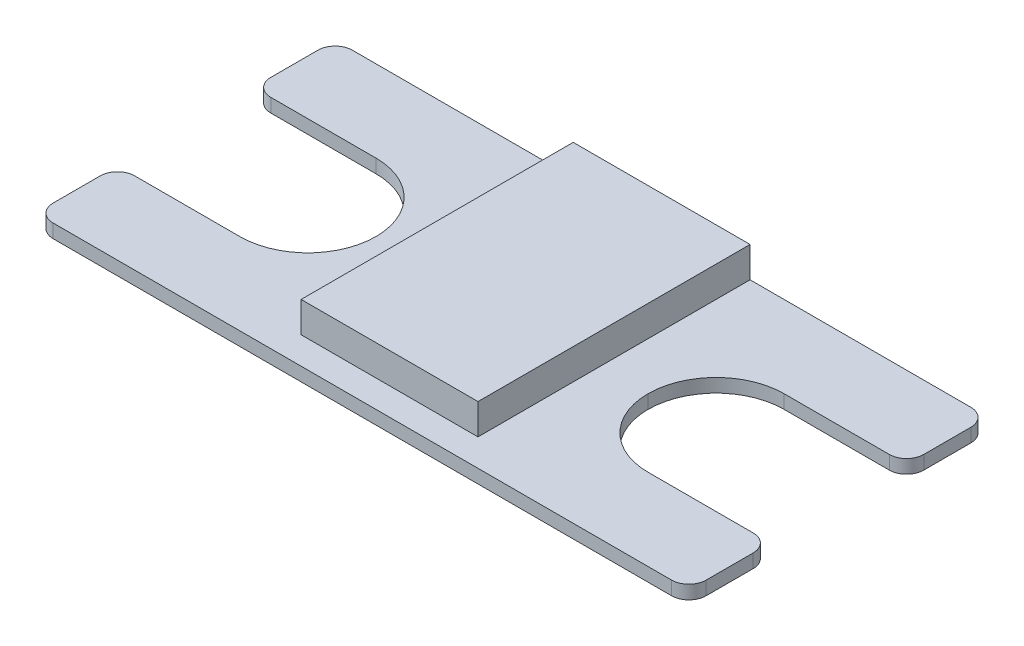
ISO-10303-21;
HEADER;
FILE_DESCRIPTION(('STEP AP214'),'2;1');
FILE_NAME('part.step','',(''),(''),'','','');
FILE_SCHEMA(('AUTOMOTIVE_DESIGN { 1 0 10303 214 1 1 1 1 }'));
ENDSEC;
DATA;
#1=APPLICATION_CONTEXT('core data for automotive mechanical design processes');
#2=APPLICATION_PROTOCOL_DEFINITION('international standard','automotive_design',2000,#1);
#3=PRODUCT_CONTEXT('',#1,'mechanical');
#4=PRODUCT('Part','Part','',(#3));
#5=PRODUCT_RELATED_PRODUCT_CATEGORY('part','',(#4));
#6=PRODUCT_DEFINITION_FORMATION('','',#4);
#7=PRODUCT_DEFINITION_CONTEXT('part definition',#1,'design');
#8=PRODUCT_DEFINITION('design','',#6,#7);
#9=PRODUCT_DEFINITION_SHAPE('','',#8);
#10=(LENGTH_UNIT() NAMED_UNIT(*) SI_UNIT(.MILLI.,.METRE.));
#11=(NAMED_UNIT(*) PLANE_ANGLE_UNIT() SI_UNIT($,.RADIAN.));
#12=(NAMED_UNIT(*) SI_UNIT($,.STERADIAN.) SOLID_ANGLE_UNIT());
#13=UNCERTAINTY_MEASURE_WITH_UNIT(LENGTH_MEASURE(1.E-05),#10,'distance_accuracy_value','');
#14=(GEOMETRIC_REPRESENTATION_CONTEXT(3) GLOBAL_UNCERTAINTY_ASSIGNED_CONTEXT((#13)) GLOBAL_UNIT_ASSIGNED_CONTEXT((#10,
#11,#12)) REPRESENTATION_CONTEXT('',''));
#15=CARTESIAN_POINT('',(0.,0.,0.));
#16=DIRECTION('',(0.,0.,1.));
#17=DIRECTION('',(1.,0.,0.));
#18=AXIS2_PLACEMENT_3D('',#15,#16,#17);
#19=CARTESIAN_POINT('',(0.,1.,0.));
#20=DIRECTION('',(0.,-1.,0.));
#21=DIRECTION('',(0.,0.,-1.));
#22=AXIS2_PLACEMENT_3D('',#19,#20,#21);
#23=PLANE('',#22);
#24=DIRECTION('',(0.,0.,1.));
#25=VECTOR('',#24,1.);
#26=CARTESIAN_POINT('',(17.5,1.,-22.));
#27=LINE('',#26,#25);
#28=CARTESIAN_POINT('',(17.5,1.,-22.));
#29=VERTEX_POINT('',#28);
#30=CARTESIAN_POINT('',(17.5,1.,-2.00000000000001));
#31=VERTEX_POINT('',#30);
#32=EDGE_CURVE('E62',#29,#31,#27,.T.);
#33=ORIENTED_EDGE('',*,*,#32,.F.);
#34=DIRECTION('',(-1.,0.,0.));
#35=VECTOR('',#34,1.);
#36=CARTESIAN_POINT('',(0.,1.,-22.));
#37=LINE('',#36,#35);
#38=CARTESIAN_POINT('',(1.27,1.,-22.));
#39=VERTEX_POINT('',#38);
#40=EDGE_CURVE('E266',#29,#39,#37,.T.);
#41=ORIENTED_EDGE('',*,*,#40,.T.);
#42=CARTESIAN_POINT('',(1.27,1.,-20.73));
#43=DIRECTION('',(0.,-1.,0.));
#44=DIRECTION('',(0.,0.,-1.));
#45=AXIS2_PLACEMENT_3D('',#42,#43,#44);
#46=CIRCLE('',#45,1.27);
#47=CARTESIAN_POINT('',(0.,1.,-20.73));
#48=VERTEX_POINT('',#47);
#49=EDGE_CURVE('E371',#39,#48,#46,.F.);
#50=ORIENTED_EDGE('',*,*,#49,.T.);
#51=DIRECTION('',(0.,0.,1.));
#52=VECTOR('',#51,1.);
#53=CARTESIAN_POINT('',(0.,1.,-16.));
#54=LINE('',#53,#52);
#55=CARTESIAN_POINT('',(0.,1.,-17.27));
#56=VERTEX_POINT('',#55);
#57=EDGE_CURVE('E270',#48,#56,#54,.T.);
#58=ORIENTED_EDGE('',*,*,#57,.T.);
#59=CARTESIAN_POINT('',(1.27,1.,-17.27));
#60=DIRECTION('',(0.,-1.,0.));
#61=DIRECTION('',(0.,0.,-1.));
#62=AXIS2_PLACEMENT_3D('',#59,#60,#61);
#63=CIRCLE('',#62,1.27);
#64=CARTESIAN_POINT('',(1.27,1.,-16.));
#65=VERTEX_POINT('',#64);
#66=EDGE_CURVE('E368',#56,#65,#63,.F.);
#67=ORIENTED_EDGE('',*,*,#66,.T.);
#68=DIRECTION('',(1.,0.,0.));
#69=VECTOR('',#68,1.);
#70=CARTESIAN_POINT('',(14.,1.,-16.));
#71=LINE('',#70,#69);
#72=CARTESIAN_POINT('',(9.,1.,-16.));
#73=VERTEX_POINT('',#72);
#74=EDGE_CURVE('E274',#65,#73,#71,.T.);
#75=ORIENTED_EDGE('',*,*,#74,.T.);
#76=CARTESIAN_POINT('',(9.,1.,-11.));
#77=DIRECTION('',(0.,-1.,0.));
#78=DIRECTION('',(0.,0.,-1.));
#79=AXIS2_PLACEMENT_3D('',#76,#77,#78);
#80=CIRCLE('',#79,5.);
#81=CARTESIAN_POINT('',(14.,1.,-11.));
#82=VERTEX_POINT('',#81);
#83=EDGE_CURVE('E11',#73,#82,#80,.T.);
#84=ORIENTED_EDGE('',*,*,#83,.T.);
#85=CARTESIAN_POINT('',(9.,1.,-11.));
#86=DIRECTION('',(0.,-1.,0.));
#87=DIRECTION('',(0.,0.,-1.));
#88=AXIS2_PLACEMENT_3D('',#85,#86,#87);
#89=CIRCLE('',#88,5.);
#90=CARTESIAN_POINT('',(8.99999999999999,1.,-6.));
#91=VERTEX_POINT('',#90);
#92=EDGE_CURVE('E460',#82,#91,#89,.T.);
#93=ORIENTED_EDGE('',*,*,#92,.T.);
#94=DIRECTION('',(-1.,0.,0.));
#95=VECTOR('',#94,1.);
#96=CARTESIAN_POINT('',(0.,1.,-6.));
#97=LINE('',#96,#95);
#98=CARTESIAN_POINT('',(1.27,1.,-6.));
#99=VERTEX_POINT('',#98);
#100=EDGE_CURVE('E278',#91,#99,#97,.T.);
#101=ORIENTED_EDGE('',*,*,#100,.T.);
#102=CARTESIAN_POINT('',(1.27,1.,-4.73));
#103=DIRECTION('',(0.,-1.,0.));
#104=DIRECTION('',(0.,0.,-1.));
#105=AXIS2_PLACEMENT_3D('',#102,#103,#104);
#106=CIRCLE('',#105,1.27);
#107=CARTESIAN_POINT('',(0.,1.,-4.73));
#108=VERTEX_POINT('',#107);
#109=EDGE_CURVE('E365',#99,#108,#106,.F.);
#110=ORIENTED_EDGE('',*,*,#109,.T.);
#111=DIRECTION('',(0.,0.,1.));
#112=VECTOR('',#111,1.);
#113=CARTESIAN_POINT('',(0.,1.,0.));
#114=LINE('',#113,#112);
#115=CARTESIAN_POINT('',(0.,1.,-1.27));
#116=VERTEX_POINT('',#115);
#117=EDGE_CURVE('E281',#108,#116,#114,.T.);
#118=ORIENTED_EDGE('',*,*,#117,.T.);
#119=CARTESIAN_POINT('',(1.27,1.,-1.27));
#120=DIRECTION('',(0.,-1.,0.));
#121=DIRECTION('',(0.,0.,-1.));
#122=AXIS2_PLACEMENT_3D('',#119,#120,#121);
#123=CIRCLE('',#122,1.27);
#124=CARTESIAN_POINT('',(1.27,1.,0.));
#125=VERTEX_POINT('',#124);
#126=EDGE_CURVE('E362',#116,#125,#123,.F.);
#127=ORIENTED_EDGE('',*,*,#126,.T.);
#128=DIRECTION('',(1.,0.,0.));
#129=VECTOR('',#128,1.);
#130=CARTESIAN_POINT('',(48.,1.,0.));
#131=LINE('',#130,#129);
#132=CARTESIAN_POINT('',(46.73,1.,0.));
#133=VERTEX_POINT('',#132);
#134=EDGE_CURVE('E246',#125,#133,#131,.T.);
#135=ORIENTED_EDGE('',*,*,#134,.T.);
#136=CARTESIAN_POINT('',(46.73,1.,-1.26999999999997));
#137=DIRECTION('',(0.,-1.,0.));
#138=DIRECTION('',(0.,0.,-1.));
#139=AXIS2_PLACEMENT_3D('',#136,#137,#138);
#140=CIRCLE('',#139,1.27);
#141=CARTESIAN_POINT('',(48.,1.,-1.26999999999997));
#142=VERTEX_POINT('',#141);
#143=EDGE_CURVE('E383',#133,#142,#140,.F.);
#144=ORIENTED_EDGE('',*,*,#143,.T.);
#145=DIRECTION('',(0.,0.,-1.));
#146=VECTOR('',#145,1.);
#147=CARTESIAN_POINT('',(48.,1.,-6.));
#148=LINE('',#147,#146);
#149=CARTESIAN_POINT('',(48.,1.,-4.73));
#150=VERTEX_POINT('',#149);
#151=EDGE_CURVE('E250',#142,#150,#148,.T.);
#152=ORIENTED_EDGE('',*,*,#151,.T.);
#153=CARTESIAN_POINT('',(46.73,1.,-4.73));
#154=DIRECTION('',(0.,-1.,0.));
#155=DIRECTION('',(0.,0.,-1.));
#156=AXIS2_PLACEMENT_3D('',#153,#154,#155);
#157=CIRCLE('',#156,1.27);
#158=CARTESIAN_POINT('',(46.73,1.,-6.));
#159=VERTEX_POINT('',#158);
#160=EDGE_CURVE('E380',#150,#159,#157,.F.);
#161=ORIENTED_EDGE('',*,*,#160,.T.);
#162=DIRECTION('',(-1.,0.,0.));
#163=VECTOR('',#162,1.);
#164=CARTESIAN_POINT('',(34.,1.,-6.));
#165=LINE('',#164,#163);
#166=CARTESIAN_POINT('',(39.,1.,-6.));
#167=VERTEX_POINT('',#166);
#168=EDGE_CURVE('E255',#159,#167,#165,.T.);
#169=ORIENTED_EDGE('',*,*,#168,.T.);
#170=CARTESIAN_POINT('',(39.,1.,-11.));
#171=DIRECTION('',(0.,-1.,0.));
#172=DIRECTION('',(0.,0.,-1.));
#173=AXIS2_PLACEMENT_3D('',#170,#171,#172);
#174=CIRCLE('',#173,5.);
#175=CARTESIAN_POINT('',(34.,1.,-11.));
#176=VERTEX_POINT('',#175);
#177=EDGE_CURVE('E448',#167,#176,#174,.T.);
#178=ORIENTED_EDGE('',*,*,#177,.T.);
#179=CARTESIAN_POINT('',(39.,1.,-11.));
#180=DIRECTION('',(0.,-1.,0.));
#181=DIRECTION('',(0.,0.,-1.));
#182=AXIS2_PLACEMENT_3D('',#179,#180,#181);
#183=CIRCLE('',#182,5.);
#184=CARTESIAN_POINT('',(39.,1.,-16.));
#185=VERTEX_POINT('',#184);
#186=EDGE_CURVE('E454',#176,#185,#183,.T.);
#187=ORIENTED_EDGE('',*,*,#186,.T.);
#188=DIRECTION('',(1.,0.,0.));
#189=VECTOR('',#188,1.);
#190=CARTESIAN_POINT('',(48.,1.,-16.));
#191=LINE('',#190,#189);
#192=CARTESIAN_POINT('',(46.73,1.,-16.));
#193=VERTEX_POINT('',#192);
#194=EDGE_CURVE('E259',#185,#193,#191,.T.);
#195=ORIENTED_EDGE('',*,*,#194,.T.);
#196=CARTESIAN_POINT('',(46.73,1.,-17.27));
#197=DIRECTION('',(0.,-1.,0.));
#198=DIRECTION('',(0.,0.,-1.));
#199=AXIS2_PLACEMENT_3D('',#196,#197,#198);
#200=CIRCLE('',#199,1.27);
#201=CARTESIAN_POINT('',(48.,1.,-17.27));
#202=VERTEX_POINT('',#201);
#203=EDGE_CURVE('E377',#193,#202,#200,.F.);
#204=ORIENTED_EDGE('',*,*,#203,.T.);
#205=DIRECTION('',(0.,0.,-1.));
#206=VECTOR('',#205,1.);
#207=CARTESIAN_POINT('',(48.,1.,-22.));
#208=LINE('',#207,#206);
#209=CARTESIAN_POINT('',(48.,1.,-20.73));
#210=VERTEX_POINT('',#209);
#211=EDGE_CURVE('E262',#202,#210,#208,.T.);
#212=ORIENTED_EDGE('',*,*,#211,.T.);
#213=CARTESIAN_POINT('',(46.73,1.,-20.73));
#214=DIRECTION('',(0.,-1.,0.));
#215=DIRECTION('',(0.,0.,-1.));
#216=AXIS2_PLACEMENT_3D('',#213,#214,#215);
#217=CIRCLE('',#216,1.27);
#218=CARTESIAN_POINT('',(46.73,1.,-22.));
#219=VERTEX_POINT('',#218);
#220=EDGE_CURVE('E374',#210,#219,#217,.F.);
#221=ORIENTED_EDGE('',*,*,#220,.T.);
#222=CARTESIAN_POINT('',(30.5,1.,-22.));
#223=VERTEX_POINT('',#222);
#224=EDGE_CURVE('E267',#219,#223,#37,.T.);
#225=ORIENTED_EDGE('',*,*,#224,.T.);
#226=DIRECTION('',(0.,0.,-1.));
#227=VECTOR('',#226,1.);
#228=CARTESIAN_POINT('',(30.5,1.,-22.));
#229=LINE('',#228,#227);
#230=CARTESIAN_POINT('',(30.5,1.,-2.00000000000001));
#231=VERTEX_POINT('',#230);
#232=EDGE_CURVE('E233',#231,#223,#229,.T.);
#233=ORIENTED_EDGE('',*,*,#232,.F.);
#234=DIRECTION('',(1.,0.,0.));
#235=VECTOR('',#234,1.);
#236=CARTESIAN_POINT('',(17.5,1.,-2.00000000000001));
#237=LINE('',#236,#235);
#238=EDGE_CURVE('E57',#31,#231,#237,.T.);
#239=ORIENTED_EDGE('',*,*,#238,.F.);
#240=EDGE_LOOP('',(#33,#41,#50,#58,#67,#75,#84,#93,#101,#110,#118,#127,#135,#144,#152,#161,#169,
#178,#187,#195,#204,#212,#221,#225,#233,#239));
#241=FACE_BOUND('',#240,.T.);
#242=ADVANCED_FACE('F39',(#241),#23,.F.);
#243=CARTESIAN_POINT('',(48.,1.,0.));
#244=DIRECTION('',(0.,0.,-1.));
#245=DIRECTION('',(-1.,0.,0.));
#246=AXIS2_PLACEMENT_3D('',#243,#244,#245);
#247=PLANE('',#246);
#248=DIRECTION('',(1.,0.,0.));
#249=VECTOR('',#248,1.);
#250=CARTESIAN_POINT('',(48.,0.,0.));
#251=LINE('',#250,#249);
#252=CARTESIAN_POINT('',(1.27,0.,0.));
#253=VERTEX_POINT('',#252);
#254=CARTESIAN_POINT('',(46.73,0.,0.));
#255=VERTEX_POINT('',#254);
#256=EDGE_CURVE('E286',#253,#255,#251,.T.);
#257=ORIENTED_EDGE('',*,*,#256,.T.);
#258=DIRECTION('',(0.,-1.,0.));
#259=VECTOR('',#258,1.);
#260=CARTESIAN_POINT('',(46.73,1.,0.));
#261=LINE('',#260,#259);
#262=EDGE_CURVE('E359',#255,#133,#261,.F.);
#263=ORIENTED_EDGE('',*,*,#262,.T.);
#264=ORIENTED_EDGE('',*,*,#134,.F.);
#265=DIRECTION('',(0.,-1.,0.));
#266=VECTOR('',#265,1.);
#267=CARTESIAN_POINT('',(1.27,1.,0.));
#268=LINE('',#267,#266);
#269=EDGE_CURVE('E355',#125,#253,#268,.T.);
#270=ORIENTED_EDGE('',*,*,#269,.T.);
#271=EDGE_LOOP('',(#257,#263,#264,#270));
#272=FACE_BOUND('',#271,.T.);
#273=ADVANCED_FACE('F526',(#272),#247,.F.);
#274=CARTESIAN_POINT('',(48.,1.,-6.));
#275=DIRECTION('',(-1.,0.,0.));
#276=DIRECTION('',(0.,0.,1.));
#277=AXIS2_PLACEMENT_3D('',#274,#275,#276);
#278=PLANE('',#277);
#279=ORIENTED_EDGE('',*,*,#151,.F.);
#280=DIRECTION('',(0.,-1.,0.));
#281=VECTOR('',#280,1.);
#282=CARTESIAN_POINT('',(48.,1.,-1.26999999999997));
#283=LINE('',#282,#281);
#284=CARTESIAN_POINT('',(48.,0.,-1.26999999999997));
#285=VERTEX_POINT('',#284);
#286=EDGE_CURVE('E325',#142,#285,#283,.T.);
#287=ORIENTED_EDGE('',*,*,#286,.T.);
#288=DIRECTION('',(0.,0.,-1.));
#289=VECTOR('',#288,1.);
#290=CARTESIAN_POINT('',(48.,0.,-6.));
#291=LINE('',#290,#289);
#292=CARTESIAN_POINT('',(48.,0.,-4.73));
#293=VERTEX_POINT('',#292);
#294=EDGE_CURVE('E290',#285,#293,#291,.T.);
#295=ORIENTED_EDGE('',*,*,#294,.T.);
#296=DIRECTION('',(0.,-1.,0.));
#297=VECTOR('',#296,1.);
#298=CARTESIAN_POINT('',(48.,1.,-4.73));
#299=LINE('',#298,#297);
#300=EDGE_CURVE('E285',#293,#150,#299,.F.);
#301=ORIENTED_EDGE('',*,*,#300,.T.);
#302=EDGE_LOOP('',(#279,#287,#295,#301));
#303=FACE_BOUND('',#302,.T.);
#304=ADVANCED_FACE('F531',(#303),#278,.F.);
#305=CARTESIAN_POINT('',(34.,1.,-6.));
#306=DIRECTION('',(0.,0.,1.));
#307=DIRECTION('',(1.,0.,0.));
#308=AXIS2_PLACEMENT_3D('',#305,#306,#307);
#309=PLANE('',#308);
#310=DIRECTION('',(-1.,0.,0.));
#311=VECTOR('',#310,1.);
#312=CARTESIAN_POINT('',(34.,0.,-6.));
#313=LINE('',#312,#311);
#314=CARTESIAN_POINT('',(46.73,0.,-6.));
#315=VERTEX_POINT('',#314);
#316=CARTESIAN_POINT('',(39.,0.,-6.));
#317=VERTEX_POINT('',#316);
#318=EDGE_CURVE('E294',#315,#317,#313,.T.);
#319=ORIENTED_EDGE('',*,*,#318,.T.);
#320=DIRECTION('',(0.,-1.,0.));
#321=VECTOR('',#320,1.);
#322=CARTESIAN_POINT('',(39.,1.,-6.));
#323=LINE('',#322,#321);
#324=EDGE_CURVE('E431',#317,#167,#323,.F.);
#325=ORIENTED_EDGE('',*,*,#324,.T.);
#326=ORIENTED_EDGE('',*,*,#168,.F.);
#327=DIRECTION('',(0.,-1.,0.));
#328=VECTOR('',#327,1.);
#329=CARTESIAN_POINT('',(46.73,1.,-6.));
#330=LINE('',#329,#328);
#331=EDGE_CURVE('E386',#159,#315,#330,.T.);
#332=ORIENTED_EDGE('',*,*,#331,.T.);
#333=EDGE_LOOP('',(#319,#325,#326,#332));
#334=FACE_BOUND('',#333,.T.);
#335=ADVANCED_FACE('F563',(#334),#309,.F.);
#336=CARTESIAN_POINT('',(48.,1.,-16.));
#337=DIRECTION('',(0.,0.,-1.));
#338=DIRECTION('',(-1.,0.,0.));
#339=AXIS2_PLACEMENT_3D('',#336,#337,#338);
#340=PLANE('',#339);
#341=ORIENTED_EDGE('',*,*,#194,.F.);
#342=DIRECTION('',(0.,-1.,0.));
#343=VECTOR('',#342,1.);
#344=CARTESIAN_POINT('',(39.,0.,-16.));
#345=LINE('',#344,#343);
#346=CARTESIAN_POINT('',(39.,0.,-16.));
#347=VERTEX_POINT('',#346);
#348=EDGE_CURVE('E435',#185,#347,#345,.T.);
#349=ORIENTED_EDGE('',*,*,#348,.T.);
#350=DIRECTION('',(1.,0.,0.));
#351=VECTOR('',#350,1.);
#352=CARTESIAN_POINT('',(48.,0.,-16.));
#353=LINE('',#352,#351);
#354=CARTESIAN_POINT('',(46.73,0.,-16.));
#355=VERTEX_POINT('',#354);
#356=EDGE_CURVE('E298',#347,#355,#353,.T.);
#357=ORIENTED_EDGE('',*,*,#356,.T.);
#358=DIRECTION('',(0.,-1.,0.));
#359=VECTOR('',#358,1.);
#360=CARTESIAN_POINT('',(46.73,1.,-16.));
#361=LINE('',#360,#359);
#362=EDGE_CURVE('E397',#355,#193,#361,.F.);
#363=ORIENTED_EDGE('',*,*,#362,.T.);
#364=EDGE_LOOP('',(#341,#349,#357,#363));
#365=FACE_BOUND('',#364,.T.);
#366=ADVANCED_FACE('F478',(#365),#340,.F.);
#367=CARTESIAN_POINT('',(48.,1.,-22.));
#368=DIRECTION('',(-1.,0.,0.));
#369=DIRECTION('',(0.,0.,1.));
#370=AXIS2_PLACEMENT_3D('',#367,#368,#369);
#371=PLANE('',#370);
#372=ORIENTED_EDGE('',*,*,#211,.F.);
#373=DIRECTION('',(0.,-1.,0.));
#374=VECTOR('',#373,1.);
#375=CARTESIAN_POINT('',(48.,1.,-17.27));
#376=LINE('',#375,#374);
#377=CARTESIAN_POINT('',(48.,0.,-17.27));
#378=VERTEX_POINT('',#377);
#379=EDGE_CURVE('E393',#202,#378,#376,.T.);
#380=ORIENTED_EDGE('',*,*,#379,.T.);
#381=DIRECTION('',(0.,0.,-1.));
#382=VECTOR('',#381,1.);
#383=CARTESIAN_POINT('',(48.,0.,-22.));
#384=LINE('',#383,#382);
#385=CARTESIAN_POINT('',(48.,0.,-20.73));
#386=VERTEX_POINT('',#385);
#387=EDGE_CURVE('E301',#378,#386,#384,.T.);
#388=ORIENTED_EDGE('',*,*,#387,.T.);
#389=DIRECTION('',(0.,-1.,0.));
#390=VECTOR('',#389,1.);
#391=CARTESIAN_POINT('',(48.,1.,-20.73));
#392=LINE('',#391,#390);
#393=EDGE_CURVE('E390',#386,#210,#392,.F.);
#394=ORIENTED_EDGE('',*,*,#393,.T.);
#395=EDGE_LOOP('',(#372,#380,#388,#394));
#396=FACE_BOUND('',#395,.T.);
#397=ADVANCED_FACE('F488',(#396),#371,.F.);
#398=CARTESIAN_POINT('',(0.,1.,-22.));
#399=DIRECTION('',(0.,0.,1.));
#400=DIRECTION('',(1.,0.,0.));
#401=AXIS2_PLACEMENT_3D('',#398,#399,#400);
#402=PLANE('',#401);
#403=ORIENTED_EDGE('',*,*,#224,.F.);
#404=DIRECTION('',(0.,-1.,0.));
#405=VECTOR('',#404,1.);
#406=CARTESIAN_POINT('',(46.73,1.,-22.));
#407=LINE('',#406,#405);
#408=CARTESIAN_POINT('',(46.73,0.,-22.));
#409=VERTEX_POINT('',#408);
#410=EDGE_CURVE('E405',#219,#409,#407,.T.);
#411=ORIENTED_EDGE('',*,*,#410,.T.);
#412=DIRECTION('',(-1.,0.,0.));
#413=VECTOR('',#412,1.);
#414=CARTESIAN_POINT('',(0.,0.,-22.));
#415=LINE('',#414,#413);
#416=CARTESIAN_POINT('',(1.27,0.,-22.));
#417=VERTEX_POINT('',#416);
#418=EDGE_CURVE('E305',#409,#417,#415,.T.);
#419=ORIENTED_EDGE('',*,*,#418,.T.);
#420=DIRECTION('',(0.,-1.,0.));
#421=VECTOR('',#420,1.);
#422=CARTESIAN_POINT('',(1.27,1.,-22.));
#423=LINE('',#422,#421);
#424=EDGE_CURVE('E401',#417,#39,#423,.F.);
#425=ORIENTED_EDGE('',*,*,#424,.T.);
#426=ORIENTED_EDGE('',*,*,#40,.F.);
#427=DIRECTION('',(0.,-1.,0.));
#428=VECTOR('',#427,1.);
#429=CARTESIAN_POINT('',(17.5,3.25,-22.));
#430=LINE('',#429,#428);
#431=CARTESIAN_POINT('',(17.5,3.25,-22.));
#432=VERTEX_POINT('',#431);
#433=EDGE_CURVE('E503',#432,#29,#430,.T.);
#434=ORIENTED_EDGE('',*,*,#433,.F.);
#435=DIRECTION('',(-1.,0.,0.));
#436=VECTOR('',#435,1.);
#437=CARTESIAN_POINT('',(17.5,3.25,-22.));
#438=LINE('',#437,#436);
#439=CARTESIAN_POINT('',(30.5,3.25,-22.));
#440=VERTEX_POINT('',#439);
#441=EDGE_CURVE('E228',#440,#432,#438,.T.);
#442=ORIENTED_EDGE('',*,*,#441,.F.);
#443=DIRECTION('',(0.,-1.,0.));
#444=VECTOR('',#443,1.);
#445=CARTESIAN_POINT('',(30.5,3.25,-22.));
#446=LINE('',#445,#444);
#447=EDGE_CURVE('E242',#440,#223,#446,.T.);
#448=ORIENTED_EDGE('',*,*,#447,.T.);
#449=EDGE_LOOP('',(#403,#411,#419,#425,#426,#434,#442,#448));
#450=FACE_BOUND('',#449,.T.);
#451=ADVANCED_FACE('F498',(#450),#402,.F.);
#452=CARTESIAN_POINT('',(0.,1.,-16.));
#453=DIRECTION('',(1.,0.,0.));
#454=DIRECTION('',(0.,0.,-1.));
#455=AXIS2_PLACEMENT_3D('',#452,#453,#454);
#456=PLANE('',#455);
#457=ORIENTED_EDGE('',*,*,#57,.F.);
#458=DIRECTION('',(0.,-1.,0.));
#459=VECTOR('',#458,1.);
#460=CARTESIAN_POINT('',(0.,1.,-20.73));
#461=LINE('',#460,#459);
#462=CARTESIAN_POINT('',(0.,0.,-20.73));
#463=VERTEX_POINT('',#462);
#464=EDGE_CURVE('E412',#48,#463,#461,.T.);
#465=ORIENTED_EDGE('',*,*,#464,.T.);
#466=DIRECTION('',(0.,0.,1.));
#467=VECTOR('',#466,1.);
#468=CARTESIAN_POINT('',(0.,0.,-16.));
#469=LINE('',#468,#467);
#470=CARTESIAN_POINT('',(0.,0.,-17.27));
#471=VERTEX_POINT('',#470);
#472=EDGE_CURVE('E309',#463,#471,#469,.T.);
#473=ORIENTED_EDGE('',*,*,#472,.T.);
#474=DIRECTION('',(0.,-1.,0.));
#475=VECTOR('',#474,1.);
#476=CARTESIAN_POINT('',(0.,1.,-17.27));
#477=LINE('',#476,#475);
#478=EDGE_CURVE('E409',#471,#56,#477,.F.);
#479=ORIENTED_EDGE('',*,*,#478,.T.);
#480=EDGE_LOOP('',(#457,#465,#473,#479));
#481=FACE_BOUND('',#480,.T.);
#482=ADVANCED_FACE('F552',(#481),#456,.F.);
#483=CARTESIAN_POINT('',(14.,1.,-16.));
#484=DIRECTION('',(0.,0.,-1.));
#485=DIRECTION('',(-1.,0.,0.));
#486=AXIS2_PLACEMENT_3D('',#483,#484,#485);
#487=PLANE('',#486);
#488=DIRECTION('',(1.,0.,0.));
#489=VECTOR('',#488,1.);
#490=CARTESIAN_POINT('',(14.,0.,-16.));
#491=LINE('',#490,#489);
#492=CARTESIAN_POINT('',(1.27,0.,-16.));
#493=VERTEX_POINT('',#492);
#494=CARTESIAN_POINT('',(9.,0.,-16.));
#495=VERTEX_POINT('',#494);
#496=EDGE_CURVE('E313',#493,#495,#491,.T.);
#497=ORIENTED_EDGE('',*,*,#496,.T.);
#498=DIRECTION('',(0.,-1.,0.));
#499=VECTOR('',#498,1.);
#500=CARTESIAN_POINT('',(9.,1.,-16.));
#501=LINE('',#500,#499);
#502=EDGE_CURVE('E442',#495,#73,#501,.F.);
#503=ORIENTED_EDGE('',*,*,#502,.T.);
#504=ORIENTED_EDGE('',*,*,#74,.F.);
#505=DIRECTION('',(0.,-1.,0.));
#506=VECTOR('',#505,1.);
#507=CARTESIAN_POINT('',(1.27,1.,-16.));
#508=LINE('',#507,#506);
#509=EDGE_CURVE('E416',#65,#493,#508,.T.);
#510=ORIENTED_EDGE('',*,*,#509,.T.);
#511=EDGE_LOOP('',(#497,#503,#504,#510));
#512=FACE_BOUND('',#511,.T.);
#513=ADVANCED_FACE('F548',(#512),#487,.F.);
#514=CARTESIAN_POINT('',(0.,1.,-6.));
#515=DIRECTION('',(0.,0.,1.));
#516=DIRECTION('',(1.,0.,0.));
#517=AXIS2_PLACEMENT_3D('',#514,#515,#516);
#518=PLANE('',#517);
#519=ORIENTED_EDGE('',*,*,#100,.F.);
#520=DIRECTION('',(0.,-1.,0.));
#521=VECTOR('',#520,1.);
#522=CARTESIAN_POINT('',(9.,0.,-6.));
#523=LINE('',#522,#521);
#524=CARTESIAN_POINT('',(8.99999999999999,0.,-6.));
#525=VERTEX_POINT('',#524);
#526=EDGE_CURVE('E438',#91,#525,#523,.T.);
#527=ORIENTED_EDGE('',*,*,#526,.T.);
#528=DIRECTION('',(-1.,0.,0.));
#529=VECTOR('',#528,1.);
#530=CARTESIAN_POINT('',(0.,0.,-6.));
#531=LINE('',#530,#529);
#532=CARTESIAN_POINT('',(1.27,0.,-6.));
#533=VERTEX_POINT('',#532);
#534=EDGE_CURVE('E317',#525,#533,#531,.T.);
#535=ORIENTED_EDGE('',*,*,#534,.T.);
#536=DIRECTION('',(0.,-1.,0.));
#537=VECTOR('',#536,1.);
#538=CARTESIAN_POINT('',(1.27,1.,-6.));
#539=LINE('',#538,#537);
#540=EDGE_CURVE('E427',#533,#99,#539,.F.);
#541=ORIENTED_EDGE('',*,*,#540,.T.);
#542=EDGE_LOOP('',(#519,#527,#535,#541));
#543=FACE_BOUND('',#542,.T.);
#544=ADVANCED_FACE('F544',(#543),#518,.F.);
#545=CARTESIAN_POINT('',(0.,1.,0.));
#546=DIRECTION('',(1.,0.,0.));
#547=DIRECTION('',(0.,0.,-1.));
#548=AXIS2_PLACEMENT_3D('',#545,#546,#547);
#549=PLANE('',#548);
#550=ORIENTED_EDGE('',*,*,#117,.F.);
#551=DIRECTION('',(0.,-1.,0.));
#552=VECTOR('',#551,1.);
#553=CARTESIAN_POINT('',(0.,1.,-4.73));
#554=LINE('',#553,#552);
#555=CARTESIAN_POINT('',(0.,0.,-4.73));
#556=VERTEX_POINT('',#555);
#557=EDGE_CURVE('E423',#108,#556,#554,.T.);
#558=ORIENTED_EDGE('',*,*,#557,.T.);
#559=DIRECTION('',(0.,0.,1.));
#560=VECTOR('',#559,1.);
#561=CARTESIAN_POINT('',(0.,0.,0.));
#562=LINE('',#561,#560);
#563=CARTESIAN_POINT('',(0.,0.,-1.27));
#564=VERTEX_POINT('',#563);
#565=EDGE_CURVE('E251',#556,#564,#562,.T.);
#566=ORIENTED_EDGE('',*,*,#565,.T.);
#567=DIRECTION('',(0.,-1.,0.));
#568=VECTOR('',#567,1.);
#569=CARTESIAN_POINT('',(0.,1.,-1.27));
#570=LINE('',#569,#568);
#571=EDGE_CURVE('E420',#564,#116,#570,.F.);
#572=ORIENTED_EDGE('',*,*,#571,.T.);
#573=EDGE_LOOP('',(#550,#558,#566,#572));
#574=FACE_BOUND('',#573,.T.);
#575=ADVANCED_FACE('F540',(#574),#549,.F.);
#576=CARTESIAN_POINT('',(0.,0.,0.));
#577=DIRECTION('',(0.,-1.,0.));
#578=DIRECTION('',(0.,0.,-1.));
#579=AXIS2_PLACEMENT_3D('',#576,#577,#578);
#580=PLANE('',#579);
#581=ORIENTED_EDGE('',*,*,#294,.F.);
#582=CARTESIAN_POINT('',(46.73,0.,-1.26999999999997));
#583=DIRECTION('',(0.,-1.,0.));
#584=DIRECTION('',(0.,0.,-1.));
#585=AXIS2_PLACEMENT_3D('',#582,#583,#584);
#586=CIRCLE('',#585,1.27);
#587=EDGE_CURVE('E352',#285,#255,#586,.T.);
#588=ORIENTED_EDGE('',*,*,#587,.T.);
#589=ORIENTED_EDGE('',*,*,#256,.F.);
#590=CARTESIAN_POINT('',(1.27,0.,-1.27));
#591=DIRECTION('',(0.,-1.,0.));
#592=DIRECTION('',(0.,0.,-1.));
#593=AXIS2_PLACEMENT_3D('',#590,#591,#592);
#594=CIRCLE('',#593,1.27);
#595=EDGE_CURVE('E329',#253,#564,#594,.T.);
#596=ORIENTED_EDGE('',*,*,#595,.T.);
#597=ORIENTED_EDGE('',*,*,#565,.F.);
#598=CARTESIAN_POINT('',(1.27,0.,-4.73));
#599=DIRECTION('',(0.,-1.,0.));
#600=DIRECTION('',(0.,0.,-1.));
#601=AXIS2_PLACEMENT_3D('',#598,#599,#600);
#602=CIRCLE('',#601,1.27);
#603=EDGE_CURVE('E332',#556,#533,#602,.T.);
#604=ORIENTED_EDGE('',*,*,#603,.T.);
#605=ORIENTED_EDGE('',*,*,#534,.F.);
#606=CARTESIAN_POINT('',(9.,0.,-11.));
#607=DIRECTION('',(0.,-1.,0.));
#608=DIRECTION('',(0.,0.,-1.));
#609=AXIS2_PLACEMENT_3D('',#606,#607,#608);
#610=CIRCLE('',#609,5.);
#611=CARTESIAN_POINT('',(14.,0.,-11.));
#612=VERTEX_POINT('',#611);
#613=EDGE_CURVE('E457',#525,#612,#610,.F.);
#614=ORIENTED_EDGE('',*,*,#613,.T.);
#615=CARTESIAN_POINT('',(9.,0.,-11.));
#616=DIRECTION('',(0.,-1.,0.));
#617=DIRECTION('',(0.,0.,-1.));
#618=AXIS2_PLACEMENT_3D('',#615,#616,#617);
#619=CIRCLE('',#618,5.);
#620=EDGE_CURVE('E49',#612,#495,#619,.F.);
#621=ORIENTED_EDGE('',*,*,#620,.T.);
#622=ORIENTED_EDGE('',*,*,#496,.F.);
#623=CARTESIAN_POINT('',(1.27,0.,-17.27));
#624=DIRECTION('',(0.,-1.,0.));
#625=DIRECTION('',(0.,0.,-1.));
#626=AXIS2_PLACEMENT_3D('',#623,#624,#625);
#627=CIRCLE('',#626,1.27);
#628=EDGE_CURVE('E336',#493,#471,#627,.T.);
#629=ORIENTED_EDGE('',*,*,#628,.T.);
#630=ORIENTED_EDGE('',*,*,#472,.F.);
#631=CARTESIAN_POINT('',(1.27,0.,-20.73));
#632=DIRECTION('',(0.,-1.,0.));
#633=DIRECTION('',(0.,0.,-1.));
#634=AXIS2_PLACEMENT_3D('',#631,#632,#633);
#635=CIRCLE('',#634,1.27);
#636=EDGE_CURVE('E339',#463,#417,#635,.T.);
#637=ORIENTED_EDGE('',*,*,#636,.T.);
#638=ORIENTED_EDGE('',*,*,#418,.F.);
#639=CARTESIAN_POINT('',(46.73,0.,-20.73));
#640=DIRECTION('',(0.,-1.,0.));
#641=DIRECTION('',(0.,0.,-1.));
#642=AXIS2_PLACEMENT_3D('',#639,#640,#641);
#643=CIRCLE('',#642,1.27);
#644=EDGE_CURVE('E342',#409,#386,#643,.T.);
#645=ORIENTED_EDGE('',*,*,#644,.T.);
#646=ORIENTED_EDGE('',*,*,#387,.F.);
#647=CARTESIAN_POINT('',(46.73,0.,-17.27));
#648=DIRECTION('',(0.,-1.,0.));
#649=DIRECTION('',(0.,0.,-1.));
#650=AXIS2_PLACEMENT_3D('',#647,#648,#649);
#651=CIRCLE('',#650,1.27);
#652=EDGE_CURVE('E345',#378,#355,#651,.T.);
#653=ORIENTED_EDGE('',*,*,#652,.T.);
#654=ORIENTED_EDGE('',*,*,#356,.F.);
#655=CARTESIAN_POINT('',(39.,0.,-11.));
#656=DIRECTION('',(0.,-1.,0.));
#657=DIRECTION('',(0.,0.,-1.));
#658=AXIS2_PLACEMENT_3D('',#655,#656,#657);
#659=CIRCLE('',#658,5.);
#660=CARTESIAN_POINT('',(34.,0.,-11.));
#661=VERTEX_POINT('',#660);
#662=EDGE_CURVE('E451',#347,#661,#659,.F.);
#663=ORIENTED_EDGE('',*,*,#662,.T.);
#664=CARTESIAN_POINT('',(39.,0.,-11.));
#665=DIRECTION('',(0.,-1.,0.));
#666=DIRECTION('',(0.,0.,-1.));
#667=AXIS2_PLACEMENT_3D('',#664,#665,#666);
#668=CIRCLE('',#667,5.);
#669=EDGE_CURVE('E445',#661,#317,#668,.F.);
#670=ORIENTED_EDGE('',*,*,#669,.T.);
#671=ORIENTED_EDGE('',*,*,#318,.F.);
#672=CARTESIAN_POINT('',(46.73,0.,-4.73));
#673=DIRECTION('',(0.,-1.,0.));
#674=DIRECTION('',(0.,0.,-1.));
#675=AXIS2_PLACEMENT_3D('',#672,#673,#674);
#676=CIRCLE('',#675,1.27);
#677=EDGE_CURVE('E349',#315,#293,#676,.T.);
#678=ORIENTED_EDGE('',*,*,#677,.T.);
#679=EDGE_LOOP('',(#581,#588,#589,#596,#597,#604,#605,#614,#621,#622,#629,#630,#637,#638,#645,
#646,#653,#654,#663,#670,#671,#678));
#680=FACE_BOUND('',#679,.T.);
#681=ADVANCED_FACE('F536',(#680),#580,.T.);
#682=CARTESIAN_POINT('',(46.73,1.,-1.26999999999997));
#683=DIRECTION('',(0.,-1.,0.));
#684=DIRECTION('',(0.,0.,-1.));
#685=AXIS2_PLACEMENT_3D('',#682,#683,#684);
#686=CYLINDRICAL_SURFACE('',#685,1.27);
#687=ORIENTED_EDGE('',*,*,#143,.F.);
#688=ORIENTED_EDGE('',*,*,#262,.F.);
#689=ORIENTED_EDGE('',*,*,#587,.F.);
#690=ORIENTED_EDGE('',*,*,#286,.F.);
#691=EDGE_LOOP('',(#687,#688,#689,#690));
#692=FACE_BOUND('',#691,.T.);
#693=ADVANCED_FACE('F539',(#692),#686,.T.);
#694=CARTESIAN_POINT('',(46.73,1.,-4.73));
#695=DIRECTION('',(0.,-1.,0.));
#696=DIRECTION('',(0.,0.,-1.));
#697=AXIS2_PLACEMENT_3D('',#694,#695,#696);
#698=CYLINDRICAL_SURFACE('',#697,1.27);
#699=ORIENTED_EDGE('',*,*,#160,.F.);
#700=ORIENTED_EDGE('',*,*,#300,.F.);
#701=ORIENTED_EDGE('',*,*,#677,.F.);
#702=ORIENTED_EDGE('',*,*,#331,.F.);
#703=EDGE_LOOP('',(#699,#700,#701,#702));
#704=FACE_BOUND('',#703,.T.);
#705=ADVANCED_FACE('F572',(#704),#698,.T.);
#706=CARTESIAN_POINT('',(46.73,1.,-17.27));
#707=DIRECTION('',(0.,-1.,0.));
#708=DIRECTION('',(0.,0.,-1.));
#709=AXIS2_PLACEMENT_3D('',#706,#707,#708);
#710=CYLINDRICAL_SURFACE('',#709,1.27);
#711=ORIENTED_EDGE('',*,*,#203,.F.);
#712=ORIENTED_EDGE('',*,*,#362,.F.);
#713=ORIENTED_EDGE('',*,*,#652,.F.);
#714=ORIENTED_EDGE('',*,*,#379,.F.);
#715=EDGE_LOOP('',(#711,#712,#713,#714));
#716=FACE_BOUND('',#715,.T.);
#717=ADVANCED_FACE('F484',(#716),#710,.T.);
#718=CARTESIAN_POINT('',(46.73,1.,-20.73));
#719=DIRECTION('',(0.,-1.,0.));
#720=DIRECTION('',(0.,0.,-1.));
#721=AXIS2_PLACEMENT_3D('',#718,#719,#720);
#722=CYLINDRICAL_SURFACE('',#721,1.27);
#723=ORIENTED_EDGE('',*,*,#220,.F.);
#724=ORIENTED_EDGE('',*,*,#393,.F.);
#725=ORIENTED_EDGE('',*,*,#644,.F.);
#726=ORIENTED_EDGE('',*,*,#410,.F.);
#727=EDGE_LOOP('',(#723,#724,#725,#726));
#728=FACE_BOUND('',#727,.T.);
#729=ADVANCED_FACE('F492',(#728),#722,.T.);
#730=CARTESIAN_POINT('',(1.27,1.,-20.73));
#731=DIRECTION('',(0.,-1.,0.));
#732=DIRECTION('',(0.,0.,-1.));
#733=AXIS2_PLACEMENT_3D('',#730,#731,#732);
#734=CYLINDRICAL_SURFACE('',#733,1.27);
#735=ORIENTED_EDGE('',*,*,#49,.F.);
#736=ORIENTED_EDGE('',*,*,#424,.F.);
#737=ORIENTED_EDGE('',*,*,#636,.F.);
#738=ORIENTED_EDGE('',*,*,#464,.F.);
#739=EDGE_LOOP('',(#735,#736,#737,#738));
#740=FACE_BOUND('',#739,.T.);
#741=ADVANCED_FACE('F581',(#740),#734,.T.);
#742=CARTESIAN_POINT('',(1.27,1.,-17.27));
#743=DIRECTION('',(0.,-1.,0.));
#744=DIRECTION('',(0.,0.,-1.));
#745=AXIS2_PLACEMENT_3D('',#742,#743,#744);
#746=CYLINDRICAL_SURFACE('',#745,1.27);
#747=ORIENTED_EDGE('',*,*,#66,.F.);
#748=ORIENTED_EDGE('',*,*,#478,.F.);
#749=ORIENTED_EDGE('',*,*,#628,.F.);
#750=ORIENTED_EDGE('',*,*,#509,.F.);
#751=EDGE_LOOP('',(#747,#748,#749,#750));
#752=FACE_BOUND('',#751,.T.);
#753=ADVANCED_FACE('F584',(#752),#746,.T.);
#754=CARTESIAN_POINT('',(1.27,1.,-4.73));
#755=DIRECTION('',(0.,-1.,0.));
#756=DIRECTION('',(0.,0.,-1.));
#757=AXIS2_PLACEMENT_3D('',#754,#755,#756);
#758=CYLINDRICAL_SURFACE('',#757,1.27);
#759=ORIENTED_EDGE('',*,*,#109,.F.);
#760=ORIENTED_EDGE('',*,*,#540,.F.);
#761=ORIENTED_EDGE('',*,*,#603,.F.);
#762=ORIENTED_EDGE('',*,*,#557,.F.);
#763=EDGE_LOOP('',(#759,#760,#761,#762));
#764=FACE_BOUND('',#763,.T.);
#765=ADVANCED_FACE('F588',(#764),#758,.T.);
#766=CARTESIAN_POINT('',(1.27,1.,-1.27));
#767=DIRECTION('',(0.,-1.,0.));
#768=DIRECTION('',(0.,0.,-1.));
#769=AXIS2_PLACEMENT_3D('',#766,#767,#768);
#770=CYLINDRICAL_SURFACE('',#769,1.27);
#771=ORIENTED_EDGE('',*,*,#126,.F.);
#772=ORIENTED_EDGE('',*,*,#571,.F.);
#773=ORIENTED_EDGE('',*,*,#595,.F.);
#774=ORIENTED_EDGE('',*,*,#269,.F.);
#775=EDGE_LOOP('',(#771,#772,#773,#774));
#776=FACE_BOUND('',#775,.T.);
#777=ADVANCED_FACE('F592',(#776),#770,.T.);
#778=CARTESIAN_POINT('',(39.,1.,-11.));
#779=DIRECTION('',(0.,1.,0.));
#780=DIRECTION('',(0.,0.,1.));
#781=AXIS2_PLACEMENT_3D('',#778,#779,#780);
#782=CYLINDRICAL_SURFACE('',#781,5.);
#783=ORIENTED_EDGE('',*,*,#348,.F.);
#784=ORIENTED_EDGE('',*,*,#186,.F.);
#785=DIRECTION('',(0.,-1.,0.));
#786=VECTOR('',#785,1.);
#787=CARTESIAN_POINT('',(34.,1.,-11.));
#788=LINE('',#787,#786);
#789=EDGE_CURVE('E241',#661,#176,#788,.F.);
#790=ORIENTED_EDGE('',*,*,#789,.F.);
#791=ORIENTED_EDGE('',*,*,#662,.F.);
#792=EDGE_LOOP('',(#783,#784,#790,#791));
#793=FACE_BOUND('',#792,.T.);
#794=ADVANCED_FACE('F475',(#793),#782,.F.);
#795=CARTESIAN_POINT('',(39.,1.,-11.));
#796=DIRECTION('',(0.,1.,0.));
#797=DIRECTION('',(0.,0.,1.));
#798=AXIS2_PLACEMENT_3D('',#795,#796,#797);
#799=CYLINDRICAL_SURFACE('',#798,5.);
#800=ORIENTED_EDGE('',*,*,#177,.F.);
#801=ORIENTED_EDGE('',*,*,#324,.F.);
#802=ORIENTED_EDGE('',*,*,#669,.F.);
#803=ORIENTED_EDGE('',*,*,#789,.T.);
#804=EDGE_LOOP('',(#800,#801,#802,#803));
#805=FACE_BOUND('',#804,.T.);
#806=ADVANCED_FACE('F469',(#805),#799,.F.);
#807=CARTESIAN_POINT('',(9.,1.,-11.));
#808=DIRECTION('',(0.,1.,0.));
#809=DIRECTION('',(0.,0.,1.));
#810=AXIS2_PLACEMENT_3D('',#807,#808,#809);
#811=CYLINDRICAL_SURFACE('',#810,5.);
#812=DIRECTION('',(0.,-1.,0.));
#813=VECTOR('',#812,1.);
#814=CARTESIAN_POINT('',(14.,0.,-11.));
#815=LINE('',#814,#813);
#816=EDGE_CURVE('E43',#82,#612,#815,.T.);
#817=ORIENTED_EDGE('',*,*,#816,.F.);
#818=ORIENTED_EDGE('',*,*,#83,.F.);
#819=ORIENTED_EDGE('',*,*,#502,.F.);
#820=ORIENTED_EDGE('',*,*,#620,.F.);
#821=EDGE_LOOP('',(#817,#818,#819,#820));
#822=FACE_BOUND('',#821,.T.);
#823=ADVANCED_FACE('F41',(#822),#811,.F.);
#824=CARTESIAN_POINT('',(9.,1.,-11.));
#825=DIRECTION('',(0.,1.,0.));
#826=DIRECTION('',(0.,0.,1.));
#827=AXIS2_PLACEMENT_3D('',#824,#825,#826);
#828=CYLINDRICAL_SURFACE('',#827,5.);
#829=ORIENTED_EDGE('',*,*,#92,.F.);
#830=ORIENTED_EDGE('',*,*,#816,.T.);
#831=ORIENTED_EDGE('',*,*,#613,.F.);
#832=ORIENTED_EDGE('',*,*,#526,.F.);
#833=EDGE_LOOP('',(#829,#830,#831,#832));
#834=FACE_BOUND('',#833,.T.);
#835=ADVANCED_FACE('F600',(#834),#828,.F.);
#836=CARTESIAN_POINT('',(17.5,3.25,-22.));
#837=DIRECTION('',(1.,0.,0.));
#838=DIRECTION('',(0.,0.,-1.));
#839=AXIS2_PLACEMENT_3D('',#836,#837,#838);
#840=PLANE('',#839);
#841=ORIENTED_EDGE('',*,*,#32,.T.);
#842=DIRECTION('',(0.,-1.,0.));
#843=VECTOR('',#842,1.);
#844=CARTESIAN_POINT('',(17.5,3.25,-2.00000000000001));
#845=LINE('',#844,#843);
#846=CARTESIAN_POINT('',(17.5,3.25,-2.00000000000001));
#847=VERTEX_POINT('',#846);
#848=EDGE_CURVE('E216',#847,#31,#845,.T.);
#849=ORIENTED_EDGE('',*,*,#848,.F.);
#850=DIRECTION('',(0.,0.,1.));
#851=VECTOR('',#850,1.);
#852=CARTESIAN_POINT('',(17.5,3.25,-22.));
#853=LINE('',#852,#851);
#854=EDGE_CURVE('E223',#432,#847,#853,.T.);
#855=ORIENTED_EDGE('',*,*,#854,.F.);
#856=ORIENTED_EDGE('',*,*,#433,.T.);
#857=EDGE_LOOP('',(#841,#849,#855,#856));
#858=FACE_BOUND('',#857,.T.);
#859=ADVANCED_FACE('F235',(#858),#840,.F.);
#860=CARTESIAN_POINT('',(17.5,3.25,-2.00000000000001));
#861=DIRECTION('',(0.,0.,-1.));
#862=DIRECTION('',(-1.,0.,0.));
#863=AXIS2_PLACEMENT_3D('',#860,#861,#862);
#864=PLANE('',#863);
#865=ORIENTED_EDGE('',*,*,#238,.T.);
#866=DIRECTION('',(0.,-1.,0.));
#867=VECTOR('',#866,1.);
#868=CARTESIAN_POINT('',(30.5,3.25,-2.00000000000001));
#869=LINE('',#868,#867);
#870=CARTESIAN_POINT('',(30.5,3.25,-2.00000000000001));
#871=VERTEX_POINT('',#870);
#872=EDGE_CURVE('E218',#871,#231,#869,.T.);
#873=ORIENTED_EDGE('',*,*,#872,.F.);
#874=DIRECTION('',(1.,0.,0.));
#875=VECTOR('',#874,1.);
#876=CARTESIAN_POINT('',(17.5,3.25,-2.00000000000001));
#877=LINE('',#876,#875);
#878=EDGE_CURVE('E212',#847,#871,#877,.T.);
#879=ORIENTED_EDGE('',*,*,#878,.F.);
#880=ORIENTED_EDGE('',*,*,#848,.T.);
#881=EDGE_LOOP('',(#865,#873,#879,#880));
#882=FACE_BOUND('',#881,.T.);
#883=ADVANCED_FACE('F214',(#882),#864,.F.);
#884=CARTESIAN_POINT('',(30.5,3.25,-22.));
#885=DIRECTION('',(-1.,0.,0.));
#886=DIRECTION('',(0.,0.,1.));
#887=AXIS2_PLACEMENT_3D('',#884,#885,#886);
#888=PLANE('',#887);
#889=ORIENTED_EDGE('',*,*,#232,.T.);
#890=ORIENTED_EDGE('',*,*,#447,.F.);
#891=DIRECTION('',(0.,0.,-1.));
#892=VECTOR('',#891,1.);
#893=CARTESIAN_POINT('',(30.5,3.25,-22.));
#894=LINE('',#893,#892);
#895=EDGE_CURVE('E222',#871,#440,#894,.T.);
#896=ORIENTED_EDGE('',*,*,#895,.F.);
#897=ORIENTED_EDGE('',*,*,#872,.T.);
#898=EDGE_LOOP('',(#889,#890,#896,#897));
#899=FACE_BOUND('',#898,.T.);
#900=ADVANCED_FACE('F516',(#899),#888,.F.);
#901=CARTESIAN_POINT('',(0.,3.25,0.));
#902=DIRECTION('',(0.,1.,0.));
#903=DIRECTION('',(0.,0.,1.));
#904=AXIS2_PLACEMENT_3D('',#901,#902,#903);
#905=PLANE('',#904);
#906=ORIENTED_EDGE('',*,*,#854,.T.);
#907=ORIENTED_EDGE('',*,*,#878,.T.);
#908=ORIENTED_EDGE('',*,*,#895,.T.);
#909=ORIENTED_EDGE('',*,*,#441,.T.);
#910=EDGE_LOOP('',(#906,#907,#908,#909));
#911=FACE_BOUND('',#910,.T.);
#912=ADVANCED_FACE('F226',(#911),#905,.T.);
#913=CLOSED_SHELL('',(#242,#273,#304,#335,#366,#397,#451,#482,#513,#544,#575,#681,#693,#705,
#717,#729,#741,#753,#765,#777,#794,#806,#823,#835,#859,#883,#900,#912));
#914=MANIFOLD_SOLID_BREP('B2',#913);
#915=ADVANCED_BREP_SHAPE_REPRESENTATION('',(#18,#914),#14);
#916=SHAPE_DEFINITION_REPRESENTATION(#9,#915);
ENDSEC;
END-ISO-10303-21;
